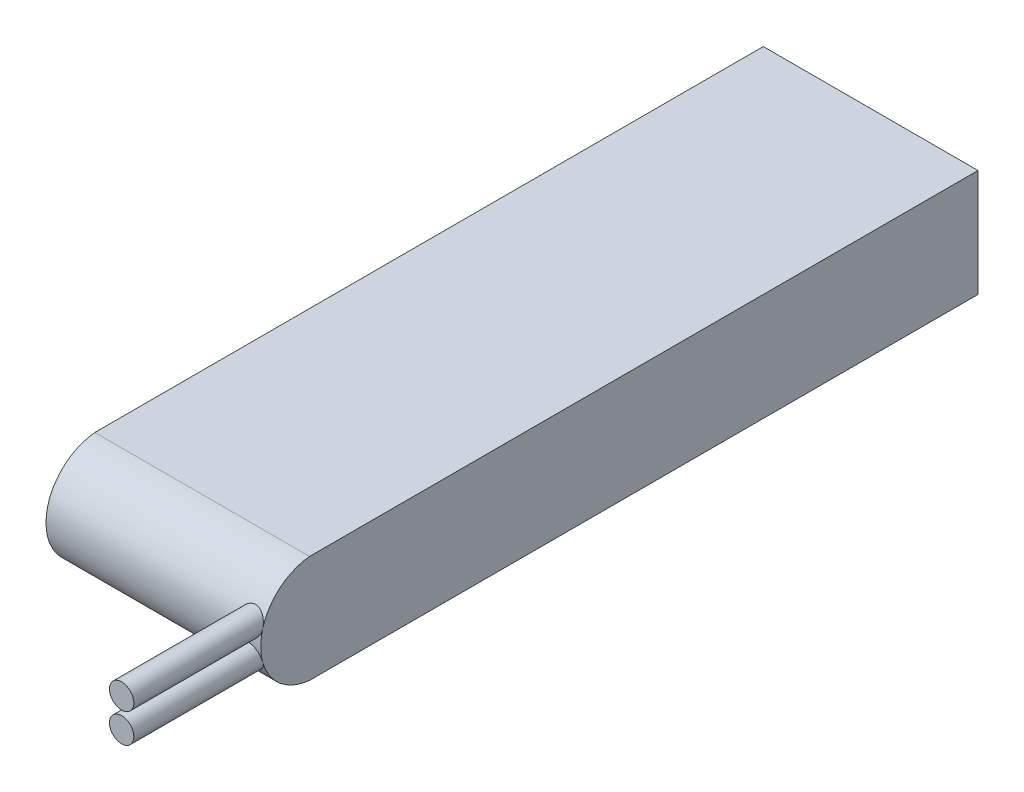
ISO-10303-21;
HEADER;
FILE_DESCRIPTION(('STEP AP214'),'2;1');
FILE_NAME('part.step','',(''),(''),'','','');
FILE_SCHEMA(('AUTOMOTIVE_DESIGN { 1 0 10303 214 1 1 1 1 }'));
ENDSEC;
DATA;
#1=APPLICATION_CONTEXT('core data for automotive mechanical design processes');
#2=APPLICATION_PROTOCOL_DEFINITION('international standard','automotive_design',2000,#1);
#3=PRODUCT_CONTEXT('',#1,'mechanical');
#4=PRODUCT('Part','Part','',(#3));
#5=PRODUCT_RELATED_PRODUCT_CATEGORY('part','',(#4));
#6=PRODUCT_DEFINITION_FORMATION('','',#4);
#7=PRODUCT_DEFINITION_CONTEXT('part definition',#1,'design');
#8=PRODUCT_DEFINITION('design','',#6,#7);
#9=PRODUCT_DEFINITION_SHAPE('','',#8);
#10=(LENGTH_UNIT() NAMED_UNIT(*) SI_UNIT(.MILLI.,.METRE.));
#11=(NAMED_UNIT(*) PLANE_ANGLE_UNIT() SI_UNIT($,.RADIAN.));
#12=(NAMED_UNIT(*) SI_UNIT($,.STERADIAN.) SOLID_ANGLE_UNIT());
#13=UNCERTAINTY_MEASURE_WITH_UNIT(LENGTH_MEASURE(1.E-05),#10,'distance_accuracy_value','');
#14=(GEOMETRIC_REPRESENTATION_CONTEXT(3) GLOBAL_UNCERTAINTY_ASSIGNED_CONTEXT((#13)) GLOBAL_UNIT_ASSIGNED_CONTEXT((#10,
#11,#12)) REPRESENTATION_CONTEXT('',''));
#15=CARTESIAN_POINT('',(0.,0.,0.));
#16=DIRECTION('',(0.,0.,1.));
#17=DIRECTION('',(1.,0.,0.));
#18=AXIS2_PLACEMENT_3D('',#15,#16,#17);
#19=CARTESIAN_POINT('',(0.,0.,137.));
#20=DIRECTION('',(1.,0.,0.));
#21=DIRECTION('',(0.,0.,-1.));
#22=AXIS2_PLACEMENT_3D('',#19,#20,#21);
#23=PLANE('',#22);
#24=DIRECTION('',(0.,-1.,0.));
#25=VECTOR('',#24,1.);
#26=CARTESIAN_POINT('',(0.,0.,0.));
#27=LINE('',#26,#25);
#28=CARTESIAN_POINT('',(0.,22.,0.));
#29=VERTEX_POINT('',#28);
#30=CARTESIAN_POINT('',(0.,0.,0.));
#31=VERTEX_POINT('',#30);
#32=EDGE_CURVE('E112',#29,#31,#27,.T.);
#33=ORIENTED_EDGE('',*,*,#32,.T.);
#34=DIRECTION('',(0.,0.,-1.));
#35=VECTOR('',#34,1.);
#36=CARTESIAN_POINT('',(0.,0.,137.));
#37=LINE('',#36,#35);
#38=CARTESIAN_POINT('',(0.,0.,137.));
#39=VERTEX_POINT('',#38);
#40=EDGE_CURVE('E138',#39,#31,#37,.T.);
#41=ORIENTED_EDGE('',*,*,#40,.F.);
#42=CARTESIAN_POINT('',(0.,11.,135.95));
#43=DIRECTION('',(1.,0.,0.));
#44=DIRECTION('',(0.,0.,-1.));
#45=AXIS2_PLACEMENT_3D('',#42,#43,#44);
#46=CIRCLE('',#45,11.05);
#47=CARTESIAN_POINT('',(0.,22.,137.));
#48=VERTEX_POINT('',#47);
#49=EDGE_CURVE('E111',#48,#39,#46,.T.);
#50=ORIENTED_EDGE('',*,*,#49,.F.);
#51=DIRECTION('',(0.,0.,-1.));
#52=VECTOR('',#51,1.);
#53=CARTESIAN_POINT('',(0.,22.,137.));
#54=LINE('',#53,#52);
#55=EDGE_CURVE('E55',#48,#29,#54,.T.);
#56=ORIENTED_EDGE('',*,*,#55,.T.);
#57=EDGE_LOOP('',(#33,#41,#50,#56));
#58=FACE_BOUND('',#57,.T.);
#59=ADVANCED_FACE('F34',(#58),#23,.F.);
#60=CARTESIAN_POINT('',(0.,0.,137.));
#61=DIRECTION('',(0.,1.,0.));
#62=DIRECTION('',(0.,0.,1.));
#63=AXIS2_PLACEMENT_3D('',#60,#61,#62);
#64=PLANE('',#63);
#65=DIRECTION('',(1.,0.,0.));
#66=VECTOR('',#65,1.);
#67=CARTESIAN_POINT('',(0.,0.,0.));
#68=LINE('',#67,#66);
#69=CARTESIAN_POINT('',(44.,0.,0.));
#70=VERTEX_POINT('',#69);
#71=EDGE_CURVE('E115',#31,#70,#68,.T.);
#72=ORIENTED_EDGE('',*,*,#71,.T.);
#73=DIRECTION('',(0.,0.,-1.));
#74=VECTOR('',#73,1.);
#75=CARTESIAN_POINT('',(44.,0.,137.));
#76=LINE('',#75,#74);
#77=CARTESIAN_POINT('',(44.,0.,137.));
#78=VERTEX_POINT('',#77);
#79=EDGE_CURVE('E142',#78,#70,#76,.T.);
#80=ORIENTED_EDGE('',*,*,#79,.F.);
#81=DIRECTION('',(1.,0.,0.));
#82=VECTOR('',#81,1.);
#83=CARTESIAN_POINT('',(0.,0.,137.));
#84=LINE('',#83,#82);
#85=EDGE_CURVE('E83',#39,#78,#84,.T.);
#86=ORIENTED_EDGE('',*,*,#85,.F.);
#87=ORIENTED_EDGE('',*,*,#40,.T.);
#88=EDGE_LOOP('',(#72,#80,#86,#87));
#89=FACE_BOUND('',#88,.T.);
#90=ADVANCED_FACE('F132',(#89),#64,.F.);
#91=CARTESIAN_POINT('',(44.,0.,137.));
#92=DIRECTION('',(-1.,0.,0.));
#93=DIRECTION('',(0.,0.,1.));
#94=AXIS2_PLACEMENT_3D('',#91,#92,#93);
#95=PLANE('',#94);
#96=CARTESIAN_POINT('',(44.,11.,135.95));
#97=DIRECTION('',(1.,0.,0.));
#98=DIRECTION('',(0.,0.,-1.));
#99=AXIS2_PLACEMENT_3D('',#96,#97,#98);
#100=CIRCLE('',#99,11.05);
#101=CARTESIAN_POINT('',(44.,14.,146.584965914379));
#102=VERTEX_POINT('',#101);
#103=CARTESIAN_POINT('',(44.,8.,146.584965914379));
#104=VERTEX_POINT('',#103);
#105=EDGE_CURVE('E93',#102,#104,#100,.T.);
#106=ORIENTED_EDGE('',*,*,#105,.T.);
#107=EDGE_CURVE('E96',#104,#78,#100,.T.);
#108=ORIENTED_EDGE('',*,*,#107,.T.);
#109=ORIENTED_EDGE('',*,*,#79,.T.);
#110=DIRECTION('',(0.,1.,0.));
#111=VECTOR('',#110,1.);
#112=CARTESIAN_POINT('',(44.,0.,0.));
#113=LINE('',#112,#111);
#114=CARTESIAN_POINT('',(44.,22.,0.));
#115=VERTEX_POINT('',#114);
#116=EDGE_CURVE('E74',#70,#115,#113,.T.);
#117=ORIENTED_EDGE('',*,*,#116,.T.);
#118=DIRECTION('',(0.,0.,-1.));
#119=VECTOR('',#118,1.);
#120=CARTESIAN_POINT('',(44.,22.,137.));
#121=LINE('',#120,#119);
#122=CARTESIAN_POINT('',(44.,22.,137.));
#123=VERTEX_POINT('',#122);
#124=EDGE_CURVE('E145',#123,#115,#121,.T.);
#125=ORIENTED_EDGE('',*,*,#124,.F.);
#126=EDGE_CURVE('E98',#123,#102,#100,.T.);
#127=ORIENTED_EDGE('',*,*,#126,.T.);
#128=EDGE_LOOP('',(#106,#108,#109,#117,#125,#127));
#129=FACE_BOUND('',#128,.T.);
#130=ADVANCED_FACE('F95',(#129),#95,.F.);
#131=CARTESIAN_POINT('',(0.,22.,137.));
#132=DIRECTION('',(0.,-1.,0.));
#133=DIRECTION('',(0.,0.,-1.));
#134=AXIS2_PLACEMENT_3D('',#131,#132,#133);
#135=PLANE('',#134);
#136=DIRECTION('',(-1.,0.,0.));
#137=VECTOR('',#136,1.);
#138=CARTESIAN_POINT('',(0.,22.,0.));
#139=LINE('',#138,#137);
#140=EDGE_CURVE('E77',#115,#29,#139,.T.);
#141=ORIENTED_EDGE('',*,*,#140,.T.);
#142=ORIENTED_EDGE('',*,*,#55,.F.);
#143=DIRECTION('',(-1.,0.,0.));
#144=VECTOR('',#143,1.);
#145=CARTESIAN_POINT('',(0.,22.,137.));
#146=LINE('',#145,#144);
#147=EDGE_CURVE('E248',#123,#48,#146,.T.);
#148=ORIENTED_EDGE('',*,*,#147,.F.);
#149=ORIENTED_EDGE('',*,*,#124,.T.);
#150=EDGE_LOOP('',(#141,#142,#148,#149));
#151=FACE_BOUND('',#150,.T.);
#152=ADVANCED_FACE('F206',(#151),#135,.F.);
#153=CARTESIAN_POINT('',(0.,0.,0.));
#154=DIRECTION('',(0.,0.,-1.));
#155=DIRECTION('',(-1.,0.,0.));
#156=AXIS2_PLACEMENT_3D('',#153,#154,#155);
#157=PLANE('',#156);
#158=ORIENTED_EDGE('',*,*,#140,.F.);
#159=ORIENTED_EDGE('',*,*,#116,.F.);
#160=ORIENTED_EDGE('',*,*,#71,.F.);
#161=ORIENTED_EDGE('',*,*,#32,.F.);
#162=EDGE_LOOP('',(#158,#159,#160,#161));
#163=FACE_BOUND('',#162,.T.);
#164=ADVANCED_FACE('F140',(#163),#157,.T.);
#165=CARTESIAN_POINT('',(0.,11.,135.95));
#166=DIRECTION('',(1.,0.,0.));
#167=DIRECTION('',(0.,0.,-1.));
#168=AXIS2_PLACEMENT_3D('',#165,#166,#167);
#169=CYLINDRICAL_SURFACE('',#168,11.05);
#170=ORIENTED_EDGE('',*,*,#107,.F.);
#171=CARTESIAN_POINT('',(39.,8.,146.584965914379));
#172=CARTESIAN_POINT('',(39.0000061816327,7.85199623180556,146.543211026828));
#173=CARTESIAN_POINT('',(39.0131848586577,7.70477876376812,146.498315537519));
#174=CARTESIAN_POINT('',(39.0646792039676,7.41625708730808,146.403823698303));
#175=CARTESIAN_POINT('',(39.1030306954651,7.27496161173315,146.354220735414));
#176=CARTESIAN_POINT('',(39.2031172369736,7.00232166439587,146.252532909949));
#177=CARTESIAN_POINT('',(39.2647952502498,6.87095385065787,146.200454369929));
#178=CARTESIAN_POINT('',(39.4098135155633,6.62086141301353,146.096133396198));
#179=CARTESIAN_POINT('',(39.4931536999702,6.50213674963629,146.043890962999));
#180=CARTESIAN_POINT('',(39.6827112782281,6.27668148151499,145.940426841978));
#181=CARTESIAN_POINT('',(39.7895659337991,6.1704457475558,145.889288979908));
#182=CARTESIAN_POINT('',(40.0223768235611,5.9777636266217,145.79333525117));
#183=CARTESIAN_POINT('',(40.1483306478923,5.89131474646602,145.748518588294));
#184=CARTESIAN_POINT('',(40.4097876726994,5.74551297634436,145.671078607662));
#185=CARTESIAN_POINT('',(40.5445092825051,5.68503042205383,145.637961433368));
#186=CARTESIAN_POINT('',(40.8247198829638,5.58838659826542,145.584316316075));
#187=CARTESIAN_POINT('',(40.9701944290979,5.55219333692667,145.563771816549));
#188=CARTESIAN_POINT('',(41.2480049640086,5.50927119266075,145.539312715745));
#189=CARTESIAN_POINT('',(41.3797092105627,5.49942388416399,145.53363987945));
#190=CARTESIAN_POINT('',(41.6429720942821,5.50062755884345,145.534331628692));
#191=CARTESIAN_POINT('',(41.7745307659277,5.51167136323389,145.540692079246));
#192=CARTESIAN_POINT('',(42.024179314716,5.55252660092233,145.56394905931));
#193=CARTESIAN_POINT('',(42.1425692537914,5.58097799542911,145.580081290137));
#194=CARTESIAN_POINT('',(42.3726375199062,5.6541349717308,145.620882602401));
#195=CARTESIAN_POINT('',(42.4843145632382,5.69884365095688,145.645553310595));
#196=CARTESIAN_POINT('',(42.704816484898,5.8058530716137,145.703318596491));
#197=CARTESIAN_POINT('',(42.8131199638946,5.86900807556252,145.736811730341));
#198=CARTESIAN_POINT('',(43.0179089460985,6.00967231462073,145.809279212968));
#199=CARTESIAN_POINT('',(43.1143890900488,6.08718801942651,145.848256030309));
#200=CARTESIAN_POINT('',(43.3049382388037,6.26474182407009,145.934521979681));
#201=CARTESIAN_POINT('',(43.3973342370988,6.3663655155454,145.982247551661));
#202=CARTESIAN_POINT('',(43.5640357658455,6.58280710227763,146.079412194215));
#203=CARTESIAN_POINT('',(43.638332298996,6.69763151808151,146.128852103098));
#204=CARTESIAN_POINT('',(43.7727651483863,6.94814933841376,146.231283162285));
#205=CARTESIAN_POINT('',(43.8311935602398,7.08478518822275,146.284224800502));
#206=CARTESIAN_POINT('',(43.9231851209223,7.36735068400455,146.38690292787));
#207=CARTESIAN_POINT('',(43.9567479426775,7.51328045219909,146.436639374852));
#208=CARTESIAN_POINT('',(43.9971773505549,7.80950071925741,146.530509222626));
#209=CARTESIAN_POINT('',(44.0042213200089,7.95975544437678,146.574677935896));
#210=CARTESIAN_POINT('',(43.990907974677,8.26088760396766,146.656262813393));
#211=CARTESIAN_POINT('',(43.9705621041028,8.41176475212011,146.693681790434));
#212=CARTESIAN_POINT('',(43.904298728088,8.69990764529236,146.758912786885));
#213=CARTESIAN_POINT('',(43.8599983703026,8.8374453586856,146.787168264879));
#214=CARTESIAN_POINT('',(43.7477651189588,9.1038211444931,146.836935454621));
#215=CARTESIAN_POINT('',(43.6798383486987,9.23266146070581,146.858448910968));
#216=CARTESIAN_POINT('',(43.5257044813562,9.47167785486518,146.894437574463));
#217=CARTESIAN_POINT('',(43.4404557017372,9.58243238526588,146.909185551156));
#218=CARTESIAN_POINT('',(43.2523797058975,9.78846759138717,146.933873330524));
#219=CARTESIAN_POINT('',(43.1495534467438,9.8837491090393,146.943813394871));
#220=CARTESIAN_POINT('',(42.9301869157279,10.0551848334025,146.959868269848));
#221=CARTESIAN_POINT('',(42.8137693529076,10.1314932768743,146.966014571859));
#222=CARTESIAN_POINT('',(42.569811440683,10.2637931302303,146.975648121932));
#223=CARTESIAN_POINT('',(42.4422707903138,10.3197839901564,146.97913529802));
#224=CARTESIAN_POINT('',(42.1787524633494,10.4101509444207,146.984339836888));
#225=CARTESIAN_POINT('',(42.0427237431119,10.4443789050994,146.986045120297));
#226=CARTESIAN_POINT('',(41.7668503403249,10.4896447879419,146.988231641135));
#227=CARTESIAN_POINT('',(41.6270055581498,10.5006821040811,146.988712846575));
#228=CARTESIAN_POINT('',(41.3468659997938,10.4992496574998,146.98864803568));
#229=CARTESIAN_POINT('',(41.2065717033512,10.4866842201403,146.988097838535));
#230=CARTESIAN_POINT('',(40.9300824219125,10.4382151596016,146.985736415633));
#231=CARTESIAN_POINT('',(40.7938875002332,10.4023111761408,146.98392517041));
#232=CARTESIAN_POINT('',(40.5294592536529,10.3081913333969,146.978422760374));
#233=CARTESIAN_POINT('',(40.4012267878045,10.2499730715159,146.974731393112));
#234=CARTESIAN_POINT('',(40.156417422328,10.1129271331614,146.964549545545));
#235=CARTESIAN_POINT('',(40.0398399107162,10.034100539586,146.958059212304));
#236=CARTESIAN_POINT('',(39.8221274076332,9.85855295179383,146.941238299272));
#237=CARTESIAN_POINT('',(39.72093265641,9.76190461119144,146.930923145397));
#238=CARTESIAN_POINT('',(39.5362933248752,9.55346002098741,146.905410480534));
#239=CARTESIAN_POINT('',(39.4528499536269,9.44166274042546,146.890212637159));
#240=CARTESIAN_POINT('',(39.3064738493872,9.20723630123327,146.854240277488));
#241=CARTESIAN_POINT('',(39.2434091850068,9.08468362717135,146.833503287588));
#242=CARTESIAN_POINT('',(39.1385429593313,8.83198902029014,146.785991131808));
#243=CARTESIAN_POINT('',(39.0967242338348,8.70185330872384,146.759220865425));
#244=CARTESIAN_POINT('',(39.043812898008,8.47590775755405,146.708289190548));
#245=CARTESIAN_POINT('',(39.0273433437524,8.38098433442436,146.685590015362));
#246=CARTESIAN_POINT('',(39.0054348457372,8.19059898013364,146.637348445309));
#247=CARTESIAN_POINT('',(38.9999960264373,8.09513704290875,146.611806018364));
#248=CARTESIAN_POINT('',(39.,8.,146.584965914379));
#249=B_SPLINE_CURVE_WITH_KNOTS('',3,(#171,#172,#173,#174,#175,#176,#177,#178,#179,#180,#181,
#182,#183,#184,#185,#186,#187,#188,#189,#190,#191,#192,#193,#194,#195,#196,#197,#198,#199,#200,
#201,#202,#203,#204,#205,#206,#207,#208,#209,#210,#211,#212,#213,#214,#215,#216,#217,#218,#219,
#220,#221,#222,#223,#224,#225,#226,#227,#228,#229,#230,#231,#232,#233,#234,#235,#236,#237,#238,
#239,#240,#241,#242,#243,#244,#245,#246,#247,#248),.UNSPECIFIED.,.T.,.F.,(4,2,2,2,2,2,2,2,2,2,2,
2,2,2,2,2,2,2,2,2,2,2,2,2,2,2,2,2,2,2,2,2,2,2,2,2,2,2,4),(0.,0.460963802254759,
0.922585024506616,1.38308473778807,1.84358301338402,2.31856932533177,2.79349575512364,
3.24490732669843,3.69572316335552,4.09016719027893,4.48447569953912,4.85133424157493,
5.21826271625959,5.60601145312574,5.99393530289706,6.42832430163816,6.86292879789538,
7.3339455609697,7.80496851953379,8.2728351722465,8.74050639835237,9.17995704764536,
9.61929388851014,10.0388938786435,10.4584710294678,10.874516779271,11.2905737897964,
11.7094332875467,12.1283037309151,12.5488757462138,12.9694542541194,13.390078058806,
13.8106797655728,14.229603270882,14.6485553003406,15.0647380161696,15.4805839688767,
15.7768888451974,16.0731970647076),.UNSPECIFIED.);
#250=EDGE_CURVE('E11',#104,#104,#249,.T.);
#251=ORIENTED_EDGE('',*,*,#250,.F.);
#252=ORIENTED_EDGE('',*,*,#105,.F.);
#253=CARTESIAN_POINT('',(44.,14.,146.584965914379));
#254=CARTESIAN_POINT('',(43.9999938183673,14.1480037681944,146.543211026828));
#255=CARTESIAN_POINT('',(43.9868151413422,14.2952212362319,146.498315537519));
#256=CARTESIAN_POINT('',(43.9353207960324,14.5837429126919,146.403823698303));
#257=CARTESIAN_POINT('',(43.8969693045349,14.7250383882669,146.354220735414));
#258=CARTESIAN_POINT('',(43.7968827630264,14.9976783356041,146.252532909949));
#259=CARTESIAN_POINT('',(43.7352047497502,15.1290461493421,146.200454369929));
#260=CARTESIAN_POINT('',(43.5901864844367,15.3791385869865,146.096133396198));
#261=CARTESIAN_POINT('',(43.5068463000298,15.4978632503637,146.043890962999));
#262=CARTESIAN_POINT('',(43.3172887217718,15.723318518485,145.940426841978));
#263=CARTESIAN_POINT('',(43.2104340662008,15.8295542524442,145.889288979908));
#264=CARTESIAN_POINT('',(42.9776231764389,16.0222363733783,145.79333525117));
#265=CARTESIAN_POINT('',(42.8516693521076,16.108685253534,145.748518588294));
#266=CARTESIAN_POINT('',(42.5902123273006,16.2544870236556,145.671078607662));
#267=CARTESIAN_POINT('',(42.4554907174949,16.3149695779462,145.637961433368));
#268=CARTESIAN_POINT('',(42.1752801170361,16.4116134017346,145.584316316075));
#269=CARTESIAN_POINT('',(42.0298055709021,16.4478066630733,145.563771816549));
#270=CARTESIAN_POINT('',(41.7519950359914,16.4907288073392,145.539312715745));
#271=CARTESIAN_POINT('',(41.6202907894373,16.500576115836,145.53363987945));
#272=CARTESIAN_POINT('',(41.3570279057179,16.4993724411565,145.534331628692));
#273=CARTESIAN_POINT('',(41.2254692340722,16.4883286367661,145.540692079246));
#274=CARTESIAN_POINT('',(40.975820685284,16.4474733990777,145.56394905931));
#275=CARTESIAN_POINT('',(40.8574307462086,16.4190220045709,145.580081290137));
#276=CARTESIAN_POINT('',(40.6273624800938,16.3458650282692,145.620882602401));
#277=CARTESIAN_POINT('',(40.5156854367618,16.3011563490431,145.645553310595));
#278=CARTESIAN_POINT('',(40.295183515102,16.1941469283863,145.703318596491));
#279=CARTESIAN_POINT('',(40.1868800361054,16.1309919244375,145.736811730341));
#280=CARTESIAN_POINT('',(39.9820910539015,15.9903276853793,145.809279212968));
#281=CARTESIAN_POINT('',(39.8856109099511,15.9128119805735,145.848256030309));
#282=CARTESIAN_POINT('',(39.6950617611963,15.7352581759299,145.934521979681));
#283=CARTESIAN_POINT('',(39.6026657629012,15.6336344844546,145.982247551661));
#284=CARTESIAN_POINT('',(39.4359642341545,15.4171928977224,146.079412194215));
#285=CARTESIAN_POINT('',(39.361667701004,15.3023684819185,146.128852103098));
#286=CARTESIAN_POINT('',(39.2272348516137,15.0518506615862,146.231283162285));
#287=CARTESIAN_POINT('',(39.1688064397602,14.9152148117773,146.284224800502));
#288=CARTESIAN_POINT('',(39.0768148790777,14.6326493159955,146.38690292787));
#289=CARTESIAN_POINT('',(39.0432520573225,14.4867195478009,146.436639374852));
#290=CARTESIAN_POINT('',(39.0028226494451,14.1904992807426,146.530509222626));
#291=CARTESIAN_POINT('',(38.9957786799911,14.0402445556232,146.574677935896));
#292=CARTESIAN_POINT('',(39.009092025323,13.7391123960323,146.656262813393));
#293=CARTESIAN_POINT('',(39.0294378958972,13.5882352478799,146.693681790434));
#294=CARTESIAN_POINT('',(39.095701271912,13.3000923547076,146.758912786885));
#295=CARTESIAN_POINT('',(39.1400016296974,13.1625546413144,146.787168264879));
#296=CARTESIAN_POINT('',(39.2522348810412,12.8961788555069,146.836935454621));
#297=CARTESIAN_POINT('',(39.3201616513013,12.7673385392942,146.858448910968));
#298=CARTESIAN_POINT('',(39.4742955186438,12.5283221451348,146.894437574463));
#299=CARTESIAN_POINT('',(39.5595442982628,12.4175676147341,146.909185551156));
#300=CARTESIAN_POINT('',(39.7476202941025,12.2115324086128,146.933873330524));
#301=CARTESIAN_POINT('',(39.8504465532562,12.1162508909607,146.943813394871));
#302=CARTESIAN_POINT('',(40.0698130842721,11.9448151665975,146.959868269848));
#303=CARTESIAN_POINT('',(40.1862306470924,11.8685067231257,146.966014571859));
#304=CARTESIAN_POINT('',(40.430188559317,11.7362068697697,146.975648121932));
#305=CARTESIAN_POINT('',(40.5577292096862,11.6802160098435,146.97913529802));
#306=CARTESIAN_POINT('',(40.8212475366506,11.5898490555793,146.984339836888));
#307=CARTESIAN_POINT('',(40.9572762568881,11.5556210949006,146.986045120297));
#308=CARTESIAN_POINT('',(41.2331496596751,11.5103552120581,146.988231641135));
#309=CARTESIAN_POINT('',(41.3729944418502,11.4993178959189,146.988712846575));
#310=CARTESIAN_POINT('',(41.6531340002062,11.5007503425002,146.98864803568));
#311=CARTESIAN_POINT('',(41.7934282966488,11.5133157798597,146.988097838535));
#312=CARTESIAN_POINT('',(42.0699175780875,11.5617848403984,146.985736415633));
#313=CARTESIAN_POINT('',(42.2061124997667,11.5976888238592,146.98392517041));
#314=CARTESIAN_POINT('',(42.4705407463471,11.6918086666031,146.978422760374));
#315=CARTESIAN_POINT('',(42.5987732121955,11.7500269284841,146.974731393112));
#316=CARTESIAN_POINT('',(42.843582577672,11.8870728668386,146.964549545545));
#317=CARTESIAN_POINT('',(42.9601600892838,11.965899460414,146.958059212304));
#318=CARTESIAN_POINT('',(43.1778725923668,12.1414470482062,146.941238299272));
#319=CARTESIAN_POINT('',(43.27906734359,12.2380953888086,146.930923145397));
#320=CARTESIAN_POINT('',(43.4637066751248,12.4465399790126,146.905410480534));
#321=CARTESIAN_POINT('',(43.547150046373,12.5583372595745,146.890212637159));
#322=CARTESIAN_POINT('',(43.6935261506128,12.7927636987667,146.854240277488));
#323=CARTESIAN_POINT('',(43.7565908149932,12.9153163728287,146.833503287588));
#324=CARTESIAN_POINT('',(43.8614570406687,13.1680109797099,146.785991131808));
#325=CARTESIAN_POINT('',(43.9032757661652,13.2981466912762,146.759220865425));
#326=CARTESIAN_POINT('',(43.956187101992,13.524092242446,146.708289190548));
#327=CARTESIAN_POINT('',(43.9726566562476,13.6190156655756,146.685590015362));
#328=CARTESIAN_POINT('',(43.9945651542628,13.8094010198664,146.637348445309));
#329=CARTESIAN_POINT('',(44.0000039735627,13.9048629570912,146.611806018364));
#330=CARTESIAN_POINT('',(44.,14.,146.584965914379));
#331=B_SPLINE_CURVE_WITH_KNOTS('',3,(#253,#254,#255,#256,#257,#258,#259,#260,#261,#262,#263,
#264,#265,#266,#267,#268,#269,#270,#271,#272,#273,#274,#275,#276,#277,#278,#279,#280,#281,#282,
#283,#284,#285,#286,#287,#288,#289,#290,#291,#292,#293,#294,#295,#296,#297,#298,#299,#300,#301,
#302,#303,#304,#305,#306,#307,#308,#309,#310,#311,#312,#313,#314,#315,#316,#317,#318,#319,#320,
#321,#322,#323,#324,#325,#326,#327,#328,#329,#330),.UNSPECIFIED.,.T.,.F.,(4,2,2,2,2,2,2,2,2,2,2,
2,2,2,2,2,2,2,2,2,2,2,2,2,2,2,2,2,2,2,2,2,2,2,2,2,2,2,4),(0.,0.460963802254761,
0.922585024506618,1.38308473778807,1.84358301338402,2.31856932533177,2.79349575512364,
3.24490732669843,3.69572316335552,4.09016719027893,4.48447569953912,4.85133424157493,
5.2182627162596,5.60601145312575,5.99393530289707,6.42832430163817,6.86292879789538,
7.3339455609697,7.80496851953379,8.27283517224652,8.74050639835237,9.17995704764536,
9.61929388851015,10.0388938786435,10.4584710294678,10.8745167792711,11.2905737897964,
11.7094332875467,12.1283037309151,12.5488757462138,12.9694542541194,13.3900780588061,
13.8106797655728,14.229603270882,14.6485553003406,15.0647380161696,15.4805839688767,
15.7768888451974,16.0731970647076),.UNSPECIFIED.);
#332=EDGE_CURVE('E47',#102,#102,#331,.T.);
#333=ORIENTED_EDGE('',*,*,#332,.F.);
#334=ORIENTED_EDGE('',*,*,#126,.F.);
#335=ORIENTED_EDGE('',*,*,#147,.T.);
#336=ORIENTED_EDGE('',*,*,#49,.T.);
#337=ORIENTED_EDGE('',*,*,#85,.T.);
#338=EDGE_LOOP('',(#170,#251,#252,#333,#334,#335,#336,#337));
#339=FACE_BOUND('',#338,.T.);
#340=ADVANCED_FACE('F103',(#339),#169,.T.);
#341=CARTESIAN_POINT('',(41.5,14.,173.));
#342=DIRECTION('',(0.,0.,-1.));
#343=DIRECTION('',(-1.,0.,0.));
#344=AXIS2_PLACEMENT_3D('',#341,#342,#343);
#345=CYLINDRICAL_SURFACE('',#344,2.5);
#346=ORIENTED_EDGE('',*,*,#332,.T.);
#347=EDGE_LOOP('',(#346));
#348=FACE_BOUND('',#347,.T.);
#349=CARTESIAN_POINT('',(41.5,14.,173.));
#350=DIRECTION('',(0.,0.,-1.));
#351=DIRECTION('',(-1.,0.,0.));
#352=AXIS2_PLACEMENT_3D('',#349,#350,#351);
#353=CIRCLE('',#352,2.5);
#354=CARTESIAN_POINT('',(39.,14.,173.));
#355=VERTEX_POINT('',#354);
#356=EDGE_CURVE('E105',#355,#355,#353,.T.);
#357=ORIENTED_EDGE('',*,*,#356,.T.);
#358=EDGE_LOOP('',(#357));
#359=FACE_BOUND('',#358,.T.);
#360=ADVANCED_FACE('F154',(#348,#359),#345,.T.);
#361=CARTESIAN_POINT('',(41.5,14.,173.));
#362=DIRECTION('',(0.,0.,-1.));
#363=DIRECTION('',(-1.,0.,0.));
#364=AXIS2_PLACEMENT_3D('',#361,#362,#363);
#365=PLANE('',#364);
#366=ORIENTED_EDGE('',*,*,#356,.F.);
#367=EDGE_LOOP('',(#366));
#368=FACE_BOUND('',#367,.T.);
#369=ADVANCED_FACE('F129',(#368),#365,.F.);
#370=CARTESIAN_POINT('',(41.5,8.,173.));
#371=DIRECTION('',(0.,0.,-1.));
#372=DIRECTION('',(-1.,0.,0.));
#373=AXIS2_PLACEMENT_3D('',#370,#371,#372);
#374=CYLINDRICAL_SURFACE('',#373,2.5);
#375=ORIENTED_EDGE('',*,*,#250,.T.);
#376=EDGE_LOOP('',(#375));
#377=FACE_BOUND('',#376,.T.);
#378=CARTESIAN_POINT('',(41.5,8.,173.));
#379=DIRECTION('',(0.,0.,-1.));
#380=DIRECTION('',(-1.,0.,0.));
#381=AXIS2_PLACEMENT_3D('',#378,#379,#380);
#382=CIRCLE('',#381,2.5);
#383=CARTESIAN_POINT('',(39.,8.,173.));
#384=VERTEX_POINT('',#383);
#385=EDGE_CURVE('E107',#384,#384,#382,.T.);
#386=ORIENTED_EDGE('',*,*,#385,.T.);
#387=EDGE_LOOP('',(#386));
#388=FACE_BOUND('',#387,.T.);
#389=ADVANCED_FACE('F121',(#377,#388),#374,.T.);
#390=CARTESIAN_POINT('',(41.5,8.,173.));
#391=DIRECTION('',(0.,0.,-1.));
#392=DIRECTION('',(-1.,0.,0.));
#393=AXIS2_PLACEMENT_3D('',#390,#391,#392);
#394=PLANE('',#393);
#395=ORIENTED_EDGE('',*,*,#385,.F.);
#396=EDGE_LOOP('',(#395));
#397=FACE_BOUND('',#396,.T.);
#398=ADVANCED_FACE('F123',(#397),#394,.F.);
#399=CLOSED_SHELL('',(#59,#90,#130,#152,#164,#340,#360,#369,#389,#398));
#400=MANIFOLD_SOLID_BREP('B2',#399);
#401=ADVANCED_BREP_SHAPE_REPRESENTATION('',(#18,#400),#14);
#402=SHAPE_DEFINITION_REPRESENTATION(#9,#401);
ENDSEC;
END-ISO-10303-21;
